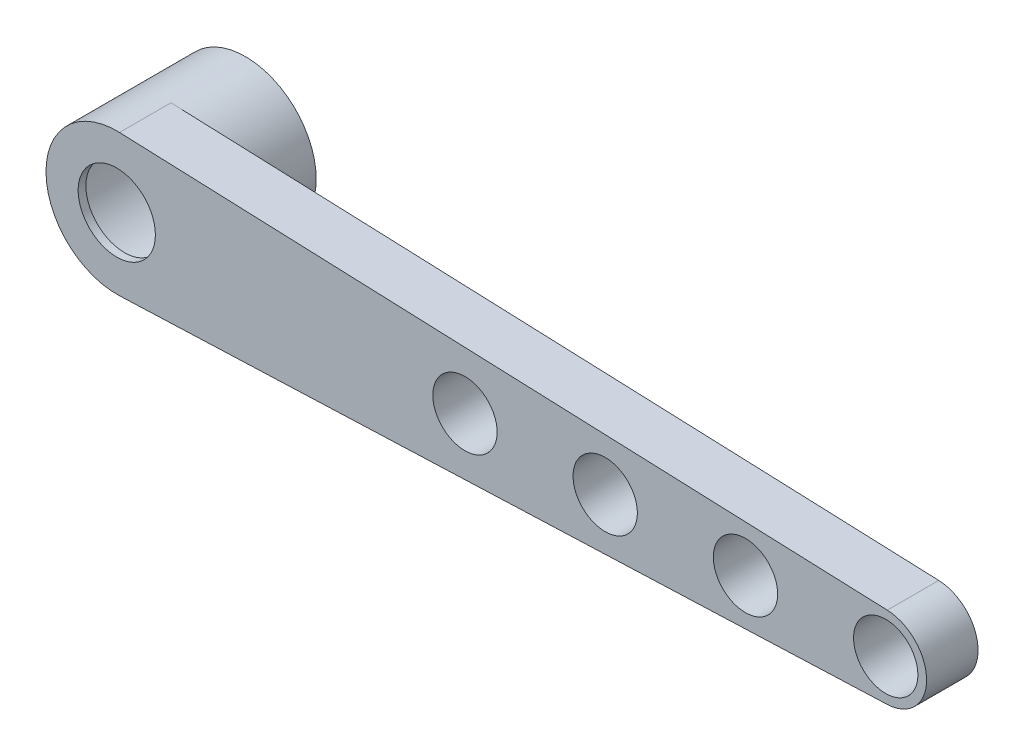
ISO-10303-21;
HEADER;
FILE_DESCRIPTION(('STEP AP214'),'2;1');
FILE_NAME('part.step','',(''),(''),'','','');
FILE_SCHEMA(('AUTOMOTIVE_DESIGN { 1 0 10303 214 1 1 1 1 }'));
ENDSEC;
DATA;
#1=APPLICATION_CONTEXT('core data for automotive mechanical design processes');
#2=APPLICATION_PROTOCOL_DEFINITION('international standard','automotive_design',2000,#1);
#3=PRODUCT_CONTEXT('',#1,'mechanical');
#4=PRODUCT('Part','Part','',(#3));
#5=PRODUCT_RELATED_PRODUCT_CATEGORY('part','',(#4));
#6=PRODUCT_DEFINITION_FORMATION('','',#4);
#7=PRODUCT_DEFINITION_CONTEXT('part definition',#1,'design');
#8=PRODUCT_DEFINITION('design','',#6,#7);
#9=PRODUCT_DEFINITION_SHAPE('','',#8);
#10=(LENGTH_UNIT() NAMED_UNIT(*) SI_UNIT(.MILLI.,.METRE.));
#11=(NAMED_UNIT(*) PLANE_ANGLE_UNIT() SI_UNIT($,.RADIAN.));
#12=(NAMED_UNIT(*) SI_UNIT($,.STERADIAN.) SOLID_ANGLE_UNIT());
#13=UNCERTAINTY_MEASURE_WITH_UNIT(LENGTH_MEASURE(1.E-05),#10,'distance_accuracy_value','');
#14=(GEOMETRIC_REPRESENTATION_CONTEXT(3) GLOBAL_UNCERTAINTY_ASSIGNED_CONTEXT((#13)) GLOBAL_UNIT_ASSIGNED_CONTEXT((#10,
#11,#12)) REPRESENTATION_CONTEXT('',''));
#15=CARTESIAN_POINT('',(0.,0.,0.));
#16=DIRECTION('',(0.,0.,1.));
#17=DIRECTION('',(1.,0.,0.));
#18=AXIS2_PLACEMENT_3D('',#15,#16,#17);
#19=CARTESIAN_POINT('',(0.,0.,5.));
#20=DIRECTION('',(0.,0.,-1.));
#21=DIRECTION('',(-1.,0.,0.));
#22=AXIS2_PLACEMENT_3D('',#19,#20,#21);
#23=CYLINDRICAL_SURFACE('',#22,2.75);
#24=CARTESIAN_POINT('',(0.,0.,0.));
#25=DIRECTION('',(0.,0.,1.));
#26=DIRECTION('',(1.,0.,0.));
#27=AXIS2_PLACEMENT_3D('',#24,#25,#26);
#28=CIRCLE('',#27,2.75);
#29=CARTESIAN_POINT('',(2.75,0.,0.));
#30=VERTEX_POINT('',#29);
#31=EDGE_CURVE('E49',#30,#30,#28,.T.);
#32=ORIENTED_EDGE('',*,*,#31,.T.);
#33=EDGE_LOOP('',(#32));
#34=FACE_BOUND('',#33,.T.);
#35=DIRECTION('',(0.,0.,1.));
#36=VECTOR('',#35,1.);
#37=CARTESIAN_POINT('',(0.107193479801559,-2.74791003453316,3.));
#38=LINE('',#37,#36);
#39=CARTESIAN_POINT('',(0.107193479801559,-2.74791003453316,3.));
#40=VERTEX_POINT('',#39);
#41=CARTESIAN_POINT('',(0.107193479801559,-2.74791003453316,5.));
#42=VERTEX_POINT('',#41);
#43=EDGE_CURVE('E103',#40,#42,#38,.T.);
#44=ORIENTED_EDGE('',*,*,#43,.T.);
#45=CARTESIAN_POINT('',(0.,0.,5.));
#46=DIRECTION('',(0.,0.,1.));
#47=DIRECTION('',(1.,0.,0.));
#48=AXIS2_PLACEMENT_3D('',#45,#46,#47);
#49=CIRCLE('',#48,2.75);
#50=CARTESIAN_POINT('',(0.106557861619695,2.74793475579881,5.));
#51=VERTEX_POINT('',#50);
#52=EDGE_CURVE('E11',#51,#42,#49,.T.);
#53=ORIENTED_EDGE('',*,*,#52,.F.);
#54=DIRECTION('',(0.,0.,1.));
#55=VECTOR('',#54,1.);
#56=CARTESIAN_POINT('',(0.106557861619695,2.74793475579881,3.));
#57=LINE('',#56,#55);
#58=CARTESIAN_POINT('',(0.106557861619695,2.74793475579881,3.));
#59=VERTEX_POINT('',#58);
#60=EDGE_CURVE('E98',#59,#51,#57,.T.);
#61=ORIENTED_EDGE('',*,*,#60,.F.);
#62=CARTESIAN_POINT('',(0.,0.,3.));
#63=DIRECTION('',(0.,0.,1.));
#64=DIRECTION('',(1.,0.,0.));
#65=AXIS2_PLACEMENT_3D('',#62,#63,#64);
#66=CIRCLE('',#65,2.75);
#67=EDGE_CURVE('E89',#40,#59,#66,.T.);
#68=ORIENTED_EDGE('',*,*,#67,.F.);
#69=EDGE_LOOP('',(#44,#53,#61,#68));
#70=FACE_BOUND('',#69,.T.);
#71=ADVANCED_FACE('F41',(#34,#70),#23,.T.);
#72=CARTESIAN_POINT('',(0.,0.,5.));
#73=DIRECTION('',(0.,0.,1.));
#74=DIRECTION('',(1.,0.,0.));
#75=AXIS2_PLACEMENT_3D('',#72,#73,#74);
#76=PLANE('',#75);
#77=CARTESIAN_POINT('',(0.,0.,5.));
#78=DIRECTION('',(0.,0.,1.));
#79=DIRECTION('',(1.,0.,0.));
#80=AXIS2_PLACEMENT_3D('',#77,#78,#79);
#81=CIRCLE('',#80,1.5);
#82=CARTESIAN_POINT('',(1.5,0.,5.));
#83=VERTEX_POINT('',#82);
#84=EDGE_CURVE('E109',#83,#83,#81,.T.);
#85=ORIENTED_EDGE('',*,*,#84,.F.);
#86=EDGE_LOOP('',(#85));
#87=FACE_BOUND('',#86,.T.);
#88=ORIENTED_EDGE('',*,*,#52,.T.);
#89=DIRECTION('',(0.999240012557513,0.038979447200567,0.));
#90=VECTOR('',#89,1.);
#91=CARTESIAN_POINT('',(0.107193479801559,-2.74791003453316,5.));
#92=LINE('',#91,#90);
#93=CARTESIAN_POINT('',(29.9419282897145,-1.58408407114983,5.));
#94=VERTEX_POINT('',#93);
#95=EDGE_CURVE('E304',#42,#94,#92,.T.);
#96=ORIENTED_EDGE('',*,*,#95,.T.);
#97=CARTESIAN_POINT('',(29.8799998001637,0.00345575100310028,5.));
#98=DIRECTION('',(0.,0.,1.));
#99=DIRECTION('',(1.,0.,0.));
#100=AXIS2_PLACEMENT_3D('',#97,#98,#99);
#101=CIRCLE('',#100,1.5887472501123);
#102=CARTESIAN_POINT('',(29.9415610763914,1.59100985528069,5.));
#103=VERTEX_POINT('',#102);
#104=EDGE_CURVE('E297',#103,#94,#101,.F.);
#105=ORIENTED_EDGE('',*,*,#104,.F.);
#106=DIRECTION('',(0.999249002108656,-0.0387483133162528,0.));
#107=VECTOR('',#106,1.);
#108=CARTESIAN_POINT('',(0.106557861619695,2.7479347557988,5.));
#109=LINE('',#108,#107);
#110=EDGE_CURVE('E56',#51,#103,#109,.T.);
#111=ORIENTED_EDGE('',*,*,#110,.F.);
#112=EDGE_LOOP('',(#88,#96,#105,#111));
#113=FACE_BOUND('',#112,.T.);
#114=CARTESIAN_POINT('',(13.53,0.,5.));
#115=DIRECTION('',(0.,0.,1.));
#116=DIRECTION('',(1.,0.,0.));
#117=AXIS2_PLACEMENT_3D('',#114,#115,#116);
#118=CIRCLE('',#117,1.25);
#119=CARTESIAN_POINT('',(14.78,0.,5.));
#120=VERTEX_POINT('',#119);
#121=EDGE_CURVE('E284',#120,#120,#118,.T.);
#122=ORIENTED_EDGE('',*,*,#121,.F.);
#123=EDGE_LOOP('',(#122));
#124=FACE_BOUND('',#123,.T.);
#125=CARTESIAN_POINT('',(18.98,0.,5.));
#126=DIRECTION('',(0.,0.,1.));
#127=DIRECTION('',(1.,0.,0.));
#128=AXIS2_PLACEMENT_3D('',#125,#126,#127);
#129=CIRCLE('',#128,1.25);
#130=CARTESIAN_POINT('',(20.23,0.,5.));
#131=VERTEX_POINT('',#130);
#132=EDGE_CURVE('E288',#131,#131,#129,.T.);
#133=ORIENTED_EDGE('',*,*,#132,.F.);
#134=EDGE_LOOP('',(#133));
#135=FACE_BOUND('',#134,.T.);
#136=CARTESIAN_POINT('',(29.8799998001637,0.00345575100310028,5.));
#137=DIRECTION('',(0.,0.,1.));
#138=DIRECTION('',(1.,0.,0.));
#139=AXIS2_PLACEMENT_3D('',#136,#137,#138);
#140=CIRCLE('',#139,1.25);
#141=CARTESIAN_POINT('',(31.1299998001637,0.00345575100310028,5.));
#142=VERTEX_POINT('',#141);
#143=EDGE_CURVE('E292',#142,#142,#140,.T.);
#144=ORIENTED_EDGE('',*,*,#143,.F.);
#145=EDGE_LOOP('',(#144));
#146=FACE_BOUND('',#145,.T.);
#147=CARTESIAN_POINT('',(24.43,0.,5.));
#148=DIRECTION('',(0.,0.,1.));
#149=DIRECTION('',(1.,0.,0.));
#150=AXIS2_PLACEMENT_3D('',#147,#148,#149);
#151=CIRCLE('',#150,1.25);
#152=CARTESIAN_POINT('',(25.68,0.,5.));
#153=VERTEX_POINT('',#152);
#154=EDGE_CURVE('E295',#153,#153,#151,.T.);
#155=ORIENTED_EDGE('',*,*,#154,.F.);
#156=EDGE_LOOP('',(#155));
#157=FACE_BOUND('',#156,.T.);
#158=ADVANCED_FACE('F124',(#87,#113,#124,#135,#146,#157),#76,.T.);
#159=CARTESIAN_POINT('',(0.,0.,0.));
#160=DIRECTION('',(0.,0.,1.));
#161=DIRECTION('',(1.,0.,0.));
#162=AXIS2_PLACEMENT_3D('',#159,#160,#161);
#163=PLANE('',#162);
#164=CARTESIAN_POINT('',(0.,0.,0.));
#165=DIRECTION('',(0.,0.,-1.));
#166=DIRECTION('',(-1.,0.,0.));
#167=AXIS2_PLACEMENT_3D('',#164,#165,#166);
#168=CIRCLE('',#167,2.5);
#169=CARTESIAN_POINT('',(-2.5,0.,0.));
#170=VERTEX_POINT('',#169);
#171=EDGE_CURVE('E115',#170,#170,#168,.T.);
#172=ORIENTED_EDGE('',*,*,#171,.F.);
#173=EDGE_LOOP('',(#172));
#174=FACE_BOUND('',#173,.T.);
#175=ORIENTED_EDGE('',*,*,#31,.F.);
#176=EDGE_LOOP('',(#175));
#177=FACE_BOUND('',#176,.T.);
#178=ADVANCED_FACE('F121',(#174,#177),#163,.F.);
#179=CARTESIAN_POINT('',(0.,0.,4.7));
#180=DIRECTION('',(0.,0.,-1.));
#181=DIRECTION('',(-1.,0.,0.));
#182=AXIS2_PLACEMENT_3D('',#179,#180,#181);
#183=CYLINDRICAL_SURFACE('',#182,2.5);
#184=CARTESIAN_POINT('',(0.,0.,4.7));
#185=DIRECTION('',(0.,0.,-1.));
#186=DIRECTION('',(-1.,0.,0.));
#187=AXIS2_PLACEMENT_3D('',#184,#185,#186);
#188=CIRCLE('',#187,2.5);
#189=CARTESIAN_POINT('',(-2.5,0.,4.7));
#190=VERTEX_POINT('',#189);
#191=EDGE_CURVE('E112',#190,#190,#188,.T.);
#192=ORIENTED_EDGE('',*,*,#191,.F.);
#193=EDGE_LOOP('',(#192));
#194=FACE_BOUND('',#193,.T.);
#195=ORIENTED_EDGE('',*,*,#171,.T.);
#196=EDGE_LOOP('',(#195));
#197=FACE_BOUND('',#196,.T.);
#198=ADVANCED_FACE('F123',(#194,#197),#183,.F.);
#199=CARTESIAN_POINT('',(0.,0.,4.7));
#200=DIRECTION('',(0.,0.,-1.));
#201=DIRECTION('',(-1.,0.,0.));
#202=AXIS2_PLACEMENT_3D('',#199,#200,#201);
#203=PLANE('',#202);
#204=CARTESIAN_POINT('',(0.,0.,4.7));
#205=DIRECTION('',(0.,0.,-1.));
#206=DIRECTION('',(-1.,0.,0.));
#207=AXIS2_PLACEMENT_3D('',#204,#205,#206);
#208=CIRCLE('',#207,1.5);
#209=CARTESIAN_POINT('',(-1.5,0.,4.7));
#210=VERTEX_POINT('',#209);
#211=EDGE_CURVE('E44',#210,#210,#208,.T.);
#212=ORIENTED_EDGE('',*,*,#211,.F.);
#213=EDGE_LOOP('',(#212));
#214=FACE_BOUND('',#213,.T.);
#215=ORIENTED_EDGE('',*,*,#191,.T.);
#216=EDGE_LOOP('',(#215));
#217=FACE_BOUND('',#216,.T.);
#218=ADVANCED_FACE('F130',(#214,#217),#203,.T.);
#219=CARTESIAN_POINT('',(0.,0.,0.3));
#220=DIRECTION('',(0.,0.,1.));
#221=DIRECTION('',(1.,0.,0.));
#222=AXIS2_PLACEMENT_3D('',#219,#220,#221);
#223=CYLINDRICAL_SURFACE('',#222,1.5);
#224=ORIENTED_EDGE('',*,*,#211,.T.);
#225=EDGE_LOOP('',(#224));
#226=FACE_BOUND('',#225,.T.);
#227=ORIENTED_EDGE('',*,*,#84,.T.);
#228=EDGE_LOOP('',(#227));
#229=FACE_BOUND('',#228,.T.);
#230=ADVANCED_FACE('F156',(#226,#229),#223,.F.);
#231=CARTESIAN_POINT('',(29.8799998001637,0.00345575100310028,3.));
#232=DIRECTION('',(0.,0.,1.));
#233=DIRECTION('',(1.,0.,0.));
#234=AXIS2_PLACEMENT_3D('',#231,#232,#233);
#235=CYLINDRICAL_SURFACE('',#234,1.5887472501123);
#236=ORIENTED_EDGE('',*,*,#104,.T.);
#237=DIRECTION('',(0.,0.,1.));
#238=VECTOR('',#237,1.);
#239=CARTESIAN_POINT('',(29.9419282897145,-1.58408407114983,3.));
#240=LINE('',#239,#238);
#241=CARTESIAN_POINT('',(29.9419282897145,-1.58408407114983,3.));
#242=VERTEX_POINT('',#241);
#243=EDGE_CURVE('E81',#242,#94,#240,.T.);
#244=ORIENTED_EDGE('',*,*,#243,.F.);
#245=CARTESIAN_POINT('',(29.8799998001637,0.00345575100310028,3.));
#246=DIRECTION('',(0.,0.,1.));
#247=DIRECTION('',(1.,0.,0.));
#248=AXIS2_PLACEMENT_3D('',#245,#246,#247);
#249=CIRCLE('',#248,1.5887472501123);
#250=CARTESIAN_POINT('',(29.9415610763914,1.59100985528069,3.));
#251=VERTEX_POINT('',#250);
#252=EDGE_CURVE('E65',#251,#242,#249,.F.);
#253=ORIENTED_EDGE('',*,*,#252,.F.);
#254=DIRECTION('',(0.,0.,1.));
#255=VECTOR('',#254,1.);
#256=CARTESIAN_POINT('',(29.9415610763914,1.59100985528069,3.));
#257=LINE('',#256,#255);
#258=EDGE_CURVE('E101',#251,#103,#257,.T.);
#259=ORIENTED_EDGE('',*,*,#258,.T.);
#260=EDGE_LOOP('',(#236,#244,#253,#259));
#261=FACE_BOUND('',#260,.T.);
#262=ADVANCED_FACE('F151',(#261),#235,.T.);
#263=CARTESIAN_POINT('',(0.107193479801559,-2.74791003453316,3.));
#264=DIRECTION('',(0.038979447200567,-0.999240012557513,0.));
#265=DIRECTION('',(0.999240012557513,0.038979447200567,0.));
#266=AXIS2_PLACEMENT_3D('',#263,#264,#265);
#267=PLANE('',#266);
#268=ORIENTED_EDGE('',*,*,#95,.F.);
#269=ORIENTED_EDGE('',*,*,#43,.F.);
#270=DIRECTION('',(0.999240012557513,0.038979447200567,0.));
#271=VECTOR('',#270,1.);
#272=CARTESIAN_POINT('',(0.107193479801559,-2.74791003453316,3.));
#273=LINE('',#272,#271);
#274=EDGE_CURVE('E91',#40,#242,#273,.T.);
#275=ORIENTED_EDGE('',*,*,#274,.T.);
#276=ORIENTED_EDGE('',*,*,#243,.T.);
#277=EDGE_LOOP('',(#268,#269,#275,#276));
#278=FACE_BOUND('',#277,.T.);
#279=ADVANCED_FACE('F155',(#278),#267,.T.);
#280=CARTESIAN_POINT('',(24.43,0.,3.));
#281=DIRECTION('',(0.,0.,1.));
#282=DIRECTION('',(1.,0.,0.));
#283=AXIS2_PLACEMENT_3D('',#280,#281,#282);
#284=CYLINDRICAL_SURFACE('',#283,1.25);
#285=CARTESIAN_POINT('',(24.43,0.,3.));
#286=DIRECTION('',(0.,0.,1.));
#287=DIRECTION('',(1.,0.,0.));
#288=AXIS2_PLACEMENT_3D('',#285,#286,#287);
#289=CIRCLE('',#288,1.25);
#290=CARTESIAN_POINT('',(25.68,0.,3.));
#291=VERTEX_POINT('',#290);
#292=EDGE_CURVE('E316',#291,#291,#289,.T.);
#293=ORIENTED_EDGE('',*,*,#292,.F.);
#294=EDGE_LOOP('',(#293));
#295=FACE_BOUND('',#294,.T.);
#296=ORIENTED_EDGE('',*,*,#154,.T.);
#297=EDGE_LOOP('',(#296));
#298=FACE_BOUND('',#297,.T.);
#299=ADVANCED_FACE('F168',(#295,#298),#284,.F.);
#300=CARTESIAN_POINT('',(29.8799998001637,0.00345575100310028,3.));
#301=DIRECTION('',(0.,0.,1.));
#302=DIRECTION('',(1.,0.,0.));
#303=AXIS2_PLACEMENT_3D('',#300,#301,#302);
#304=CYLINDRICAL_SURFACE('',#303,1.25);
#305=CARTESIAN_POINT('',(29.8799998001637,0.00345575100310028,3.));
#306=DIRECTION('',(0.,0.,1.));
#307=DIRECTION('',(1.,0.,0.));
#308=AXIS2_PLACEMENT_3D('',#305,#306,#307);
#309=CIRCLE('',#308,1.25);
#310=CARTESIAN_POINT('',(31.1299998001637,0.00345575100310028,3.));
#311=VERTEX_POINT('',#310);
#312=EDGE_CURVE('E311',#311,#311,#309,.T.);
#313=ORIENTED_EDGE('',*,*,#312,.F.);
#314=EDGE_LOOP('',(#313));
#315=FACE_BOUND('',#314,.T.);
#316=ORIENTED_EDGE('',*,*,#143,.T.);
#317=EDGE_LOOP('',(#316));
#318=FACE_BOUND('',#317,.T.);
#319=ADVANCED_FACE('F178',(#315,#318),#304,.F.);
#320=CARTESIAN_POINT('',(18.98,0.,3.));
#321=DIRECTION('',(0.,0.,1.));
#322=DIRECTION('',(1.,0.,0.));
#323=AXIS2_PLACEMENT_3D('',#320,#321,#322);
#324=CYLINDRICAL_SURFACE('',#323,1.25);
#325=CARTESIAN_POINT('',(18.98,0.,3.));
#326=DIRECTION('',(0.,0.,1.));
#327=DIRECTION('',(1.,0.,0.));
#328=AXIS2_PLACEMENT_3D('',#325,#326,#327);
#329=CIRCLE('',#328,1.25);
#330=CARTESIAN_POINT('',(20.23,0.,3.));
#331=VERTEX_POINT('',#330);
#332=EDGE_CURVE('E307',#331,#331,#329,.T.);
#333=ORIENTED_EDGE('',*,*,#332,.F.);
#334=EDGE_LOOP('',(#333));
#335=FACE_BOUND('',#334,.T.);
#336=ORIENTED_EDGE('',*,*,#132,.T.);
#337=EDGE_LOOP('',(#336));
#338=FACE_BOUND('',#337,.T.);
#339=ADVANCED_FACE('F189',(#335,#338),#324,.F.);
#340=CARTESIAN_POINT('',(13.53,0.,3.));
#341=DIRECTION('',(0.,0.,1.));
#342=DIRECTION('',(1.,0.,0.));
#343=AXIS2_PLACEMENT_3D('',#340,#341,#342);
#344=CYLINDRICAL_SURFACE('',#343,1.25);
#345=CARTESIAN_POINT('',(13.53,0.,3.));
#346=DIRECTION('',(0.,0.,1.));
#347=DIRECTION('',(1.,0.,0.));
#348=AXIS2_PLACEMENT_3D('',#345,#346,#347);
#349=CIRCLE('',#348,1.25);
#350=CARTESIAN_POINT('',(14.78,0.,3.));
#351=VERTEX_POINT('',#350);
#352=EDGE_CURVE('E305',#351,#351,#349,.T.);
#353=ORIENTED_EDGE('',*,*,#352,.F.);
#354=EDGE_LOOP('',(#353));
#355=FACE_BOUND('',#354,.T.);
#356=ORIENTED_EDGE('',*,*,#121,.T.);
#357=EDGE_LOOP('',(#356));
#358=FACE_BOUND('',#357,.T.);
#359=ADVANCED_FACE('F200',(#355,#358),#344,.F.);
#360=CARTESIAN_POINT('',(0.106557861619695,2.7479347557988,3.));
#361=DIRECTION('',(-0.0387483133162528,-0.999249002108656,0.));
#362=DIRECTION('',(0.999249002108656,-0.0387483133162528,0.));
#363=AXIS2_PLACEMENT_3D('',#360,#361,#362);
#364=PLANE('',#363);
#365=ORIENTED_EDGE('',*,*,#110,.T.);
#366=ORIENTED_EDGE('',*,*,#258,.F.);
#367=DIRECTION('',(0.999249002108656,-0.0387483133162528,0.));
#368=VECTOR('',#367,1.);
#369=CARTESIAN_POINT('',(0.106557861619695,2.7479347557988,3.));
#370=LINE('',#369,#368);
#371=EDGE_CURVE('E86',#59,#251,#370,.T.);
#372=ORIENTED_EDGE('',*,*,#371,.F.);
#373=ORIENTED_EDGE('',*,*,#60,.T.);
#374=EDGE_LOOP('',(#365,#366,#372,#373));
#375=FACE_BOUND('',#374,.T.);
#376=ADVANCED_FACE('F97',(#375),#364,.F.);
#377=CARTESIAN_POINT('',(0.,0.,3.));
#378=DIRECTION('',(0.,0.,1.));
#379=DIRECTION('',(1.,0.,0.));
#380=AXIS2_PLACEMENT_3D('',#377,#378,#379);
#381=PLANE('',#380);
#382=ORIENTED_EDGE('',*,*,#352,.T.);
#383=EDGE_LOOP('',(#382));
#384=FACE_BOUND('',#383,.T.);
#385=ORIENTED_EDGE('',*,*,#332,.T.);
#386=EDGE_LOOP('',(#385));
#387=FACE_BOUND('',#386,.T.);
#388=ORIENTED_EDGE('',*,*,#312,.T.);
#389=EDGE_LOOP('',(#388));
#390=FACE_BOUND('',#389,.T.);
#391=ORIENTED_EDGE('',*,*,#292,.T.);
#392=EDGE_LOOP('',(#391));
#393=FACE_BOUND('',#392,.T.);
#394=ORIENTED_EDGE('',*,*,#252,.T.);
#395=ORIENTED_EDGE('',*,*,#274,.F.);
#396=ORIENTED_EDGE('',*,*,#67,.T.);
#397=ORIENTED_EDGE('',*,*,#371,.T.);
#398=EDGE_LOOP('',(#394,#395,#396,#397));
#399=FACE_BOUND('',#398,.T.);
#400=ADVANCED_FACE('F90',(#384,#387,#390,#393,#399),#381,.F.);
#401=CLOSED_SHELL('',(#71,#158,#178,#198,#218,#230,#262,#279,#299,#319,#339,#359,#376,#400));
#402=MANIFOLD_SOLID_BREP('B2',#401);
#403=ADVANCED_BREP_SHAPE_REPRESENTATION('',(#18,#402),#14);
#404=SHAPE_DEFINITION_REPRESENTATION(#9,#403);
ENDSEC;
END-ISO-10303-21;
